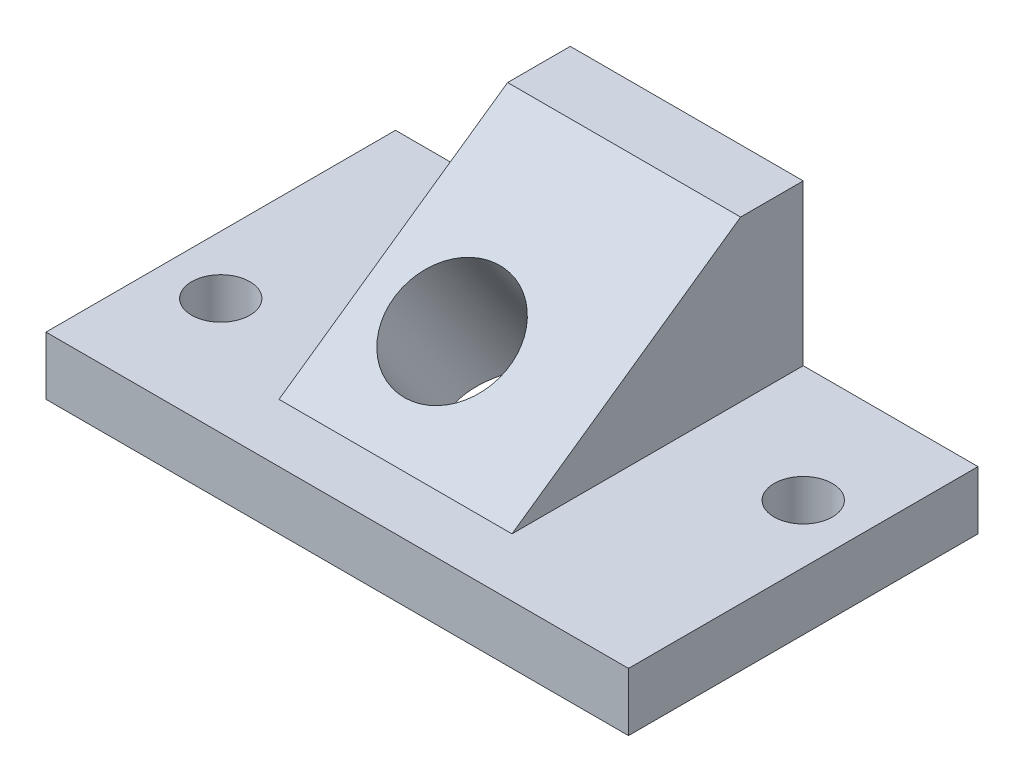
ISO-10303-21;
HEADER;
FILE_DESCRIPTION(('STEP AP214'),'2;1');
FILE_NAME('part.step','',(''),(''),'','','');
FILE_SCHEMA(('AUTOMOTIVE_DESIGN { 1 0 10303 214 1 1 1 1 }'));
ENDSEC;
DATA;
#1=APPLICATION_CONTEXT('core data for automotive mechanical design processes');
#2=APPLICATION_PROTOCOL_DEFINITION('international standard','automotive_design',2000,#1);
#3=PRODUCT_CONTEXT('',#1,'mechanical');
#4=PRODUCT('Part','Part','',(#3));
#5=PRODUCT_RELATED_PRODUCT_CATEGORY('part','',(#4));
#6=PRODUCT_DEFINITION_FORMATION('','',#4);
#7=PRODUCT_DEFINITION_CONTEXT('part definition',#1,'design');
#8=PRODUCT_DEFINITION('design','',#6,#7);
#9=PRODUCT_DEFINITION_SHAPE('','',#8);
#10=(LENGTH_UNIT() NAMED_UNIT(*) SI_UNIT(.MILLI.,.METRE.));
#11=(NAMED_UNIT(*) PLANE_ANGLE_UNIT() SI_UNIT($,.RADIAN.));
#12=(NAMED_UNIT(*) SI_UNIT($,.STERADIAN.) SOLID_ANGLE_UNIT());
#13=UNCERTAINTY_MEASURE_WITH_UNIT(LENGTH_MEASURE(1.E-05),#10,'distance_accuracy_value','');
#14=(GEOMETRIC_REPRESENTATION_CONTEXT(3) GLOBAL_UNCERTAINTY_ASSIGNED_CONTEXT((#13)) GLOBAL_UNIT_ASSIGNED_CONTEXT((#10,
#11,#12)) REPRESENTATION_CONTEXT('',''));
#15=CARTESIAN_POINT('',(0.,0.,0.));
#16=DIRECTION('',(0.,0.,1.));
#17=DIRECTION('',(1.,0.,0.));
#18=AXIS2_PLACEMENT_3D('',#15,#16,#17);
#19=CARTESIAN_POINT('',(-63.5,12.7,38.1));
#20=DIRECTION('',(-1.,0.,0.));
#21=DIRECTION('',(0.,0.,1.));
#22=AXIS2_PLACEMENT_3D('',#19,#20,#21);
#23=PLANE('',#22);
#24=DIRECTION('',(0.,0.,-1.));
#25=VECTOR('',#24,1.);
#26=CARTESIAN_POINT('',(-63.5,0.,38.1));
#27=LINE('',#26,#25);
#28=CARTESIAN_POINT('',(-63.5,0.,38.1));
#29=VERTEX_POINT('',#28);
#30=CARTESIAN_POINT('',(-63.5,0.,-38.1));
#31=VERTEX_POINT('',#30);
#32=EDGE_CURVE('E98',#29,#31,#27,.T.);
#33=ORIENTED_EDGE('',*,*,#32,.F.);
#34=DIRECTION('',(0.,-1.,0.));
#35=VECTOR('',#34,1.);
#36=CARTESIAN_POINT('',(-63.5,12.7,38.1));
#37=LINE('',#36,#35);
#38=CARTESIAN_POINT('',(-63.5,12.7,38.1));
#39=VERTEX_POINT('',#38);
#40=EDGE_CURVE('E11',#39,#29,#37,.T.);
#41=ORIENTED_EDGE('',*,*,#40,.F.);
#42=DIRECTION('',(0.,0.,-1.));
#43=VECTOR('',#42,1.);
#44=CARTESIAN_POINT('',(-63.5,12.7,38.1));
#45=LINE('',#44,#43);
#46=CARTESIAN_POINT('',(-63.5,12.7,-38.1));
#47=VERTEX_POINT('',#46);
#48=EDGE_CURVE('E140',#39,#47,#45,.T.);
#49=ORIENTED_EDGE('',*,*,#48,.T.);
#50=DIRECTION('',(0.,-1.,0.));
#51=VECTOR('',#50,1.);
#52=CARTESIAN_POINT('',(-63.5,12.7,-38.1));
#53=LINE('',#52,#51);
#54=EDGE_CURVE('E150',#47,#31,#53,.T.);
#55=ORIENTED_EDGE('',*,*,#54,.T.);
#56=EDGE_LOOP('',(#33,#41,#49,#55));
#57=FACE_BOUND('',#56,.T.);
#58=ADVANCED_FACE('F32',(#57),#23,.T.);
#59=CARTESIAN_POINT('',(-63.5,12.7,38.1));
#60=DIRECTION('',(0.,0.,-1.));
#61=DIRECTION('',(-1.,0.,0.));
#62=AXIS2_PLACEMENT_3D('',#59,#60,#61);
#63=PLANE('',#62);
#64=DIRECTION('',(1.,0.,0.));
#65=VECTOR('',#64,1.);
#66=CARTESIAN_POINT('',(-63.5,0.,38.1));
#67=LINE('',#66,#65);
#68=CARTESIAN_POINT('',(63.5,0.,38.1));
#69=VERTEX_POINT('',#68);
#70=EDGE_CURVE('E142',#29,#69,#67,.T.);
#71=ORIENTED_EDGE('',*,*,#70,.T.);
#72=DIRECTION('',(0.,-1.,0.));
#73=VECTOR('',#72,1.);
#74=CARTESIAN_POINT('',(63.5,12.7,38.1));
#75=LINE('',#74,#73);
#76=CARTESIAN_POINT('',(63.5,12.7,38.1));
#77=VERTEX_POINT('',#76);
#78=EDGE_CURVE('E41',#77,#69,#75,.T.);
#79=ORIENTED_EDGE('',*,*,#78,.F.);
#80=DIRECTION('',(1.,0.,0.));
#81=VECTOR('',#80,1.);
#82=CARTESIAN_POINT('',(-63.5,12.7,38.1));
#83=LINE('',#82,#81);
#84=EDGE_CURVE('E153',#39,#77,#83,.T.);
#85=ORIENTED_EDGE('',*,*,#84,.F.);
#86=ORIENTED_EDGE('',*,*,#40,.T.);
#87=EDGE_LOOP('',(#71,#79,#85,#86));
#88=FACE_BOUND('',#87,.T.);
#89=ADVANCED_FACE('F217',(#88),#63,.F.);
#90=CARTESIAN_POINT('',(63.5,12.7,-38.1));
#91=DIRECTION('',(1.,0.,0.));
#92=DIRECTION('',(0.,0.,-1.));
#93=AXIS2_PLACEMENT_3D('',#90,#91,#92);
#94=PLANE('',#93);
#95=DIRECTION('',(0.,0.,1.));
#96=VECTOR('',#95,1.);
#97=CARTESIAN_POINT('',(63.5,0.,-38.1));
#98=LINE('',#97,#96);
#99=CARTESIAN_POINT('',(63.5,0.,-38.1));
#100=VERTEX_POINT('',#99);
#101=EDGE_CURVE('E158',#100,#69,#98,.T.);
#102=ORIENTED_EDGE('',*,*,#101,.F.);
#103=DIRECTION('',(0.,-1.,0.));
#104=VECTOR('',#103,1.);
#105=CARTESIAN_POINT('',(63.5,12.7,-38.1));
#106=LINE('',#105,#104);
#107=CARTESIAN_POINT('',(63.5,12.7,-38.1));
#108=VERTEX_POINT('',#107);
#109=EDGE_CURVE('E152',#108,#100,#106,.T.);
#110=ORIENTED_EDGE('',*,*,#109,.F.);
#111=DIRECTION('',(0.,0.,1.));
#112=VECTOR('',#111,1.);
#113=CARTESIAN_POINT('',(63.5,12.7,-38.1));
#114=LINE('',#113,#112);
#115=EDGE_CURVE('E145',#108,#77,#114,.T.);
#116=ORIENTED_EDGE('',*,*,#115,.T.);
#117=ORIENTED_EDGE('',*,*,#78,.T.);
#118=EDGE_LOOP('',(#102,#110,#116,#117));
#119=FACE_BOUND('',#118,.T.);
#120=ADVANCED_FACE('F172',(#119),#94,.T.);
#121=CARTESIAN_POINT('',(63.5,12.7,-38.1));
#122=DIRECTION('',(0.,0.,1.));
#123=DIRECTION('',(1.,0.,0.));
#124=AXIS2_PLACEMENT_3D('',#121,#122,#123);
#125=PLANE('',#124);
#126=DIRECTION('',(-1.,0.,0.));
#127=VECTOR('',#126,1.);
#128=CARTESIAN_POINT('',(63.5,0.,-38.1));
#129=LINE('',#128,#127);
#130=EDGE_CURVE('E161',#100,#31,#129,.T.);
#131=ORIENTED_EDGE('',*,*,#130,.T.);
#132=ORIENTED_EDGE('',*,*,#54,.F.);
#133=DIRECTION('',(-1.,0.,0.));
#134=VECTOR('',#133,1.);
#135=CARTESIAN_POINT('',(63.5,12.7,-38.1));
#136=LINE('',#135,#134);
#137=CARTESIAN_POINT('',(-25.4,12.7,-38.1));
#138=VERTEX_POINT('',#137);
#139=EDGE_CURVE('E120',#138,#47,#136,.T.);
#140=ORIENTED_EDGE('',*,*,#139,.F.);
#141=DIRECTION('',(0.,-1.,0.));
#142=VECTOR('',#141,1.);
#143=CARTESIAN_POINT('',(-25.4,47.6,-38.1));
#144=LINE('',#143,#142);
#145=CARTESIAN_POINT('',(-25.4,47.6,-38.1));
#146=VERTEX_POINT('',#145);
#147=EDGE_CURVE('E112',#146,#138,#144,.T.);
#148=ORIENTED_EDGE('',*,*,#147,.F.);
#149=DIRECTION('',(1.,0.,0.));
#150=VECTOR('',#149,1.);
#151=CARTESIAN_POINT('',(-25.4,47.6,-38.1));
#152=LINE('',#151,#150);
#153=CARTESIAN_POINT('',(25.4,47.6,-38.1));
#154=VERTEX_POINT('',#153);
#155=EDGE_CURVE('E126',#146,#154,#152,.T.);
#156=ORIENTED_EDGE('',*,*,#155,.T.);
#157=DIRECTION('',(0.,-1.,0.));
#158=VECTOR('',#157,1.);
#159=CARTESIAN_POINT('',(25.4,47.6,-38.1));
#160=LINE('',#159,#158);
#161=CARTESIAN_POINT('',(25.4,12.7,-38.1));
#162=VERTEX_POINT('',#161);
#163=EDGE_CURVE('E113',#154,#162,#160,.T.);
#164=ORIENTED_EDGE('',*,*,#163,.T.);
#165=EDGE_CURVE('E148',#108,#162,#136,.T.);
#166=ORIENTED_EDGE('',*,*,#165,.F.);
#167=ORIENTED_EDGE('',*,*,#109,.T.);
#168=EDGE_LOOP('',(#131,#132,#140,#148,#156,#164,#166,#167));
#169=FACE_BOUND('',#168,.T.);
#170=ADVANCED_FACE('F176',(#169),#125,.F.);
#171=CARTESIAN_POINT('',(-63.5,12.7,38.1));
#172=DIRECTION('',(0.,-1.,0.));
#173=DIRECTION('',(0.,0.,-1.));
#174=AXIS2_PLACEMENT_3D('',#171,#172,#173);
#175=PLANE('',#174);
#176=CARTESIAN_POINT('',(-50.8,12.700000000109,12.7));
#177=DIRECTION('',(0.,1.,0.));
#178=DIRECTION('',(0.,0.,1.));
#179=AXIS2_PLACEMENT_3D('',#176,#177,#178);
#180=CIRCLE('',#179,6.35);
#181=CARTESIAN_POINT('',(-50.8,12.700000000109,19.05));
#182=VERTEX_POINT('',#181);
#183=EDGE_CURVE('E189',#182,#182,#180,.T.);
#184=ORIENTED_EDGE('',*,*,#183,.F.);
#185=EDGE_LOOP('',(#184));
#186=FACE_BOUND('',#185,.T.);
#187=CARTESIAN_POINT('',(50.8,12.700000000109,-12.7));
#188=DIRECTION('',(0.,1.,0.));
#189=DIRECTION('',(0.,0.,1.));
#190=AXIS2_PLACEMENT_3D('',#187,#188,#189);
#191=CIRCLE('',#190,6.35);
#192=CARTESIAN_POINT('',(50.8,12.700000000109,-6.35));
#193=VERTEX_POINT('',#192);
#194=EDGE_CURVE('E182',#193,#193,#191,.T.);
#195=ORIENTED_EDGE('',*,*,#194,.F.);
#196=EDGE_LOOP('',(#195));
#197=FACE_BOUND('',#196,.T.);
#198=ORIENTED_EDGE('',*,*,#165,.T.);
#199=DIRECTION('',(0.,0.,1.));
#200=VECTOR('',#199,1.);
#201=CARTESIAN_POINT('',(25.4,12.7,-38.1));
#202=LINE('',#201,#200);
#203=CARTESIAN_POINT('',(25.4,12.7,25.4));
#204=VERTEX_POINT('',#203);
#205=EDGE_CURVE('E35',#162,#204,#202,.T.);
#206=ORIENTED_EDGE('',*,*,#205,.T.);
#207=DIRECTION('',(1.,0.,0.));
#208=VECTOR('',#207,1.);
#209=CARTESIAN_POINT('',(-25.4,12.7,25.4));
#210=LINE('',#209,#208);
#211=CARTESIAN_POINT('',(-25.4,12.7,25.4));
#212=VERTEX_POINT('',#211);
#213=EDGE_CURVE('E94',#212,#204,#210,.T.);
#214=ORIENTED_EDGE('',*,*,#213,.F.);
#215=DIRECTION('',(0.,0.,1.));
#216=VECTOR('',#215,1.);
#217=CARTESIAN_POINT('',(-25.4,12.7,-38.1));
#218=LINE('',#217,#216);
#219=EDGE_CURVE('E54',#138,#212,#218,.T.);
#220=ORIENTED_EDGE('',*,*,#219,.F.);
#221=ORIENTED_EDGE('',*,*,#139,.T.);
#222=ORIENTED_EDGE('',*,*,#48,.F.);
#223=ORIENTED_EDGE('',*,*,#84,.T.);
#224=ORIENTED_EDGE('',*,*,#115,.F.);
#225=EDGE_LOOP('',(#198,#206,#214,#220,#221,#222,#223,#224));
#226=FACE_BOUND('',#225,.T.);
#227=ADVANCED_FACE('F96',(#186,#197,#226),#175,.F.);
#228=CARTESIAN_POINT('',(-63.5,0.,38.1));
#229=DIRECTION('',(0.,-1.,0.));
#230=DIRECTION('',(0.,0.,-1.));
#231=AXIS2_PLACEMENT_3D('',#228,#229,#230);
#232=PLANE('',#231);
#233=CARTESIAN_POINT('',(-6.3,0.,-11.2607324222709));
#234=DIRECTION('',(0.,-1.,0.));
#235=DIRECTION('',(0.,0.,1.));
#236=AXIS2_PLACEMENT_3D('',#233,#234,#235);
#237=ELLIPSE('',#236,15.5038372772704,12.7);
#238=CARTESIAN_POINT('',(-6.3,0.,4.24310485499957));
#239=VERTEX_POINT('',#238);
#240=EDGE_CURVE('E192',#239,#239,#237,.T.);
#241=ORIENTED_EDGE('',*,*,#240,.F.);
#242=EDGE_LOOP('',(#241));
#243=FACE_BOUND('',#242,.T.);
#244=CARTESIAN_POINT('',(-50.8,0.,12.7));
#245=DIRECTION('',(0.,1.,0.));
#246=DIRECTION('',(0.,0.,1.));
#247=AXIS2_PLACEMENT_3D('',#244,#245,#246);
#248=CIRCLE('',#247,6.35);
#249=CARTESIAN_POINT('',(-50.8,0.,19.05));
#250=VERTEX_POINT('',#249);
#251=EDGE_CURVE('E187',#250,#250,#248,.T.);
#252=ORIENTED_EDGE('',*,*,#251,.T.);
#253=EDGE_LOOP('',(#252));
#254=FACE_BOUND('',#253,.T.);
#255=CARTESIAN_POINT('',(50.8,0.,-12.7));
#256=DIRECTION('',(0.,1.,0.));
#257=DIRECTION('',(0.,0.,1.));
#258=AXIS2_PLACEMENT_3D('',#255,#256,#257);
#259=CIRCLE('',#258,6.35);
#260=CARTESIAN_POINT('',(50.8,0.,-6.35));
#261=VERTEX_POINT('',#260);
#262=EDGE_CURVE('E180',#261,#261,#259,.T.);
#263=ORIENTED_EDGE('',*,*,#262,.T.);
#264=EDGE_LOOP('',(#263));
#265=FACE_BOUND('',#264,.T.);
#266=ORIENTED_EDGE('',*,*,#32,.T.);
#267=ORIENTED_EDGE('',*,*,#130,.F.);
#268=ORIENTED_EDGE('',*,*,#101,.T.);
#269=ORIENTED_EDGE('',*,*,#70,.F.);
#270=EDGE_LOOP('',(#266,#267,#268,#269));
#271=FACE_BOUND('',#270,.T.);
#272=ADVANCED_FACE('F205',(#243,#254,#265,#271),#232,.T.);
#273=CARTESIAN_POINT('',(-25.4,12.7,25.4));
#274=DIRECTION('',(0.,-0.819152044288995,-0.573576436351042));
#275=DIRECTION('',(0.,0.573576436351042,-0.819152044288995));
#276=AXIS2_PLACEMENT_3D('',#273,#274,#275);
#277=PLANE('',#276);
#278=CARTESIAN_POINT('',(-6.3,25.7467377750253,6.76732745211034));
#279=DIRECTION('',(0.,0.819152044288995,0.573576436351042));
#280=DIRECTION('',(0.,-0.573576436351042,0.819152044288995));
#281=AXIS2_PLACEMENT_3D('',#278,#279,#280);
#282=CIRCLE('',#281,12.7);
#283=CARTESIAN_POINT('',(-6.3,18.4623170333671,17.1705584145806));
#284=VERTEX_POINT('',#283);
#285=EDGE_CURVE('E197',#284,#284,#282,.T.);
#286=ORIENTED_EDGE('',*,*,#285,.F.);
#287=EDGE_LOOP('',(#286));
#288=FACE_BOUND('',#287,.T.);
#289=DIRECTION('',(0.,0.573576436351042,-0.819152044288995));
#290=VECTOR('',#289,1.);
#291=CARTESIAN_POINT('',(25.4,12.7,25.4));
#292=LINE('',#291,#290);
#293=CARTESIAN_POINT('',(25.4,47.6,-24.4423654353004));
#294=VERTEX_POINT('',#293);
#295=EDGE_CURVE('E136',#204,#294,#292,.T.);
#296=ORIENTED_EDGE('',*,*,#295,.T.);
#297=DIRECTION('',(1.,0.,0.));
#298=VECTOR('',#297,1.);
#299=CARTESIAN_POINT('',(-25.4,47.6,-24.4423654353004));
#300=LINE('',#299,#298);
#301=CARTESIAN_POINT('',(-25.4,47.6,-24.4423654353004));
#302=VERTEX_POINT('',#301);
#303=EDGE_CURVE('E99',#302,#294,#300,.T.);
#304=ORIENTED_EDGE('',*,*,#303,.F.);
#305=DIRECTION('',(0.,0.573576436351042,-0.819152044288995));
#306=VECTOR('',#305,1.);
#307=CARTESIAN_POINT('',(-25.4,12.7,25.4));
#308=LINE('',#307,#306);
#309=EDGE_CURVE('E102',#212,#302,#308,.T.);
#310=ORIENTED_EDGE('',*,*,#309,.F.);
#311=ORIENTED_EDGE('',*,*,#213,.T.);
#312=EDGE_LOOP('',(#296,#304,#310,#311));
#313=FACE_BOUND('',#312,.T.);
#314=ADVANCED_FACE('F103',(#288,#313),#277,.F.);
#315=CARTESIAN_POINT('',(-25.4,47.6,-24.4423654353004));
#316=DIRECTION('',(0.,-1.,0.));
#317=DIRECTION('',(0.,0.,-1.));
#318=AXIS2_PLACEMENT_3D('',#315,#316,#317);
#319=PLANE('',#318);
#320=DIRECTION('',(0.,0.,-1.));
#321=VECTOR('',#320,1.);
#322=CARTESIAN_POINT('',(25.4,47.6,-24.4423654353004));
#323=LINE('',#322,#321);
#324=EDGE_CURVE('E116',#294,#154,#323,.T.);
#325=ORIENTED_EDGE('',*,*,#324,.T.);
#326=ORIENTED_EDGE('',*,*,#155,.F.);
#327=DIRECTION('',(0.,0.,-1.));
#328=VECTOR('',#327,1.);
#329=CARTESIAN_POINT('',(-25.4,47.6,-24.4423654353004));
#330=LINE('',#329,#328);
#331=EDGE_CURVE('E107',#302,#146,#330,.T.);
#332=ORIENTED_EDGE('',*,*,#331,.F.);
#333=ORIENTED_EDGE('',*,*,#303,.T.);
#334=EDGE_LOOP('',(#325,#326,#332,#333));
#335=FACE_BOUND('',#334,.T.);
#336=ADVANCED_FACE('F204',(#335),#319,.F.);
#337=CARTESIAN_POINT('',(-25.4,12.7,-38.1));
#338=DIRECTION('',(1.,0.,0.));
#339=DIRECTION('',(0.,0.,-1.));
#340=AXIS2_PLACEMENT_3D('',#337,#338,#339);
#341=PLANE('',#340);
#342=ORIENTED_EDGE('',*,*,#219,.T.);
#343=ORIENTED_EDGE('',*,*,#309,.T.);
#344=ORIENTED_EDGE('',*,*,#331,.T.);
#345=ORIENTED_EDGE('',*,*,#147,.T.);
#346=EDGE_LOOP('',(#342,#343,#344,#345));
#347=FACE_BOUND('',#346,.T.);
#348=ADVANCED_FACE('F110',(#347),#341,.F.);
#349=CARTESIAN_POINT('',(25.4,12.7,-38.1));
#350=DIRECTION('',(1.,0.,0.));
#351=DIRECTION('',(0.,0.,-1.));
#352=AXIS2_PLACEMENT_3D('',#349,#350,#351);
#353=PLANE('',#352);
#354=ORIENTED_EDGE('',*,*,#205,.F.);
#355=ORIENTED_EDGE('',*,*,#163,.F.);
#356=ORIENTED_EDGE('',*,*,#324,.F.);
#357=ORIENTED_EDGE('',*,*,#295,.F.);
#358=EDGE_LOOP('',(#354,#355,#356,#357));
#359=FACE_BOUND('',#358,.T.);
#360=ADVANCED_FACE('F179',(#359),#353,.T.);
#361=CARTESIAN_POINT('',(50.8,0.,-12.7));
#362=DIRECTION('',(0.,1.,0.));
#363=DIRECTION('',(0.,0.,1.));
#364=AXIS2_PLACEMENT_3D('',#361,#362,#363);
#365=CYLINDRICAL_SURFACE('',#364,6.35);
#366=ORIENTED_EDGE('',*,*,#262,.F.);
#367=EDGE_LOOP('',(#366));
#368=FACE_BOUND('',#367,.T.);
#369=ORIENTED_EDGE('',*,*,#194,.T.);
#370=EDGE_LOOP('',(#369));
#371=FACE_BOUND('',#370,.T.);
#372=ADVANCED_FACE('F244',(#368,#371),#365,.F.);
#373=CARTESIAN_POINT('',(-50.8,0.,12.7));
#374=DIRECTION('',(0.,1.,0.));
#375=DIRECTION('',(0.,0.,1.));
#376=AXIS2_PLACEMENT_3D('',#373,#374,#375);
#377=CYLINDRICAL_SURFACE('',#376,6.35);
#378=ORIENTED_EDGE('',*,*,#251,.F.);
#379=EDGE_LOOP('',(#378));
#380=FACE_BOUND('',#379,.T.);
#381=ORIENTED_EDGE('',*,*,#183,.T.);
#382=EDGE_LOOP('',(#381));
#383=FACE_BOUND('',#382,.T.);
#384=ADVANCED_FACE('F246',(#380,#383),#377,.F.);
#385=CARTESIAN_POINT('',(-6.3,-12.6103543373607,-20.0905975887863));
#386=DIRECTION('',(0.,0.819152044288995,0.573576436351042));
#387=DIRECTION('',(0.,-0.573576436351042,0.819152044288995));
#388=AXIS2_PLACEMENT_3D('',#385,#386,#387);
#389=CYLINDRICAL_SURFACE('',#388,12.7);
#390=ORIENTED_EDGE('',*,*,#240,.T.);
#391=EDGE_LOOP('',(#390));
#392=FACE_BOUND('',#391,.T.);
#393=ORIENTED_EDGE('',*,*,#285,.T.);
#394=EDGE_LOOP('',(#393));
#395=FACE_BOUND('',#394,.T.);
#396=ADVANCED_FACE('F201',(#392,#395),#389,.F.);
#397=CLOSED_SHELL('',(#58,#89,#120,#170,#227,#272,#314,#336,#348,#360,#372,#384,#396));
#398=MANIFOLD_SOLID_BREP('B2',#397);
#399=ADVANCED_BREP_SHAPE_REPRESENTATION('',(#18,#398),#14);
#400=SHAPE_DEFINITION_REPRESENTATION(#9,#399);
ENDSEC;
END-ISO-10303-21;
